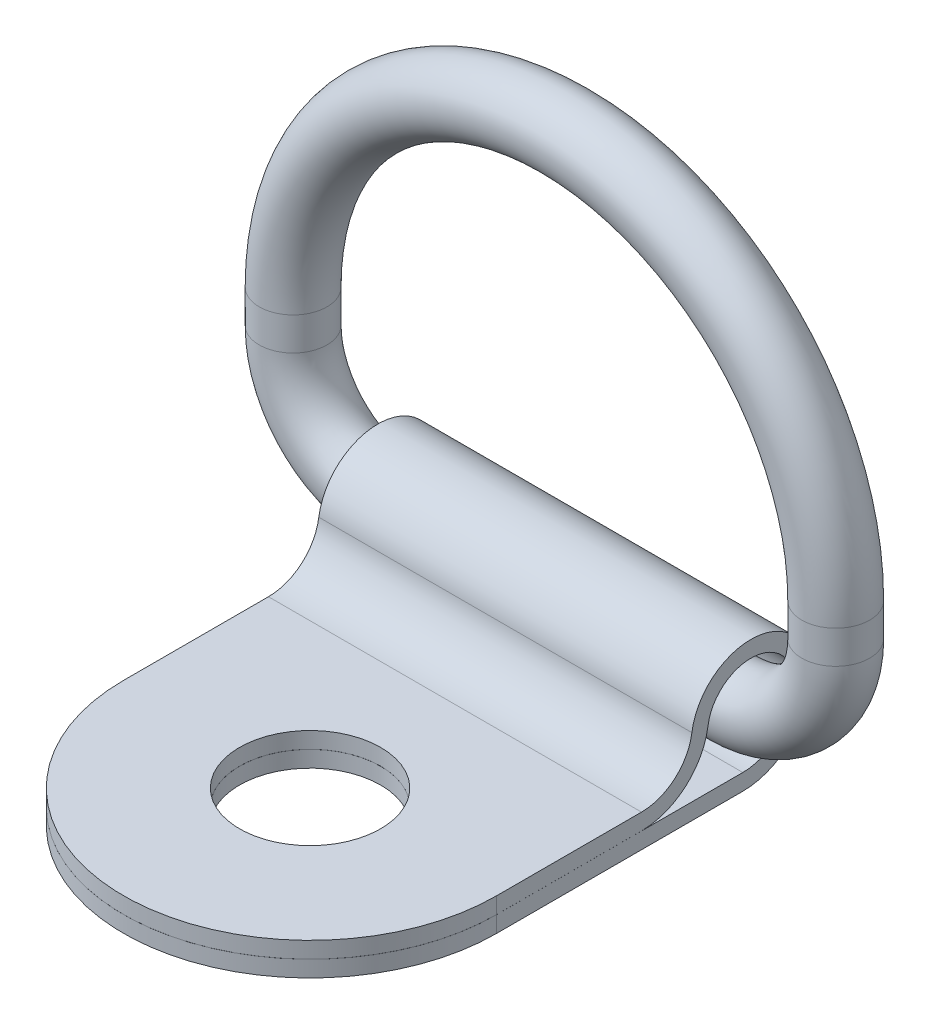
ISO-10303-21;
HEADER;
FILE_DESCRIPTION(('STEP AP214'),'2;1');
FILE_NAME('part.step','',(''),(''),'','','');
FILE_SCHEMA(('AUTOMOTIVE_DESIGN { 1 0 10303 214 1 1 1 1 }'));
ENDSEC;
DATA;
#1=APPLICATION_CONTEXT('core data for automotive mechanical design processes');
#2=APPLICATION_PROTOCOL_DEFINITION('international standard','automotive_design',2000,#1);
#3=PRODUCT_CONTEXT('',#1,'mechanical');
#4=PRODUCT('Part','Part','',(#3));
#5=PRODUCT_RELATED_PRODUCT_CATEGORY('part','',(#4));
#6=PRODUCT_DEFINITION_FORMATION('','',#4);
#7=PRODUCT_DEFINITION_CONTEXT('part definition',#1,'design');
#8=PRODUCT_DEFINITION('design','',#6,#7);
#9=PRODUCT_DEFINITION_SHAPE('','',#8);
#10=(LENGTH_UNIT() NAMED_UNIT(*) SI_UNIT(.MILLI.,.METRE.));
#11=(NAMED_UNIT(*) PLANE_ANGLE_UNIT() SI_UNIT($,.RADIAN.));
#12=(NAMED_UNIT(*) SI_UNIT($,.STERADIAN.) SOLID_ANGLE_UNIT());
#13=UNCERTAINTY_MEASURE_WITH_UNIT(LENGTH_MEASURE(1.E-05),#10,'distance_accuracy_value','');
#14=(GEOMETRIC_REPRESENTATION_CONTEXT(3) GLOBAL_UNCERTAINTY_ASSIGNED_CONTEXT((#13)) GLOBAL_UNIT_ASSIGNED_CONTEXT((#10,
#11,#12)) REPRESENTATION_CONTEXT('',''));
#15=CARTESIAN_POINT('',(0.,0.,0.));
#16=DIRECTION('',(0.,0.,1.));
#17=DIRECTION('',(1.,0.,0.));
#18=AXIS2_PLACEMENT_3D('',#15,#16,#17);
#19=CARTESIAN_POINT('',(8.73125,0.,0.381));
#20=DIRECTION('',(-1.,0.,0.));
#21=DIRECTION('',(0.,0.,1.));
#22=AXIS2_PLACEMENT_3D('',#19,#20,#21);
#23=CYLINDRICAL_SURFACE('',#22,3.175);
#24=DIRECTION('',(-1.,0.,0.));
#25=VECTOR('',#24,1.);
#26=CARTESIAN_POINT('',(8.73125,-1.24434078933385,-2.54));
#27=LINE('',#26,#25);
#28=CARTESIAN_POINT('',(8.73125,-1.24434078933385,-2.54));
#29=VERTEX_POINT('',#28);
#30=CARTESIAN_POINT('',(-8.73125,-1.24434078933385,-2.54));
#31=VERTEX_POINT('',#30);
#32=EDGE_CURVE('E61',#29,#31,#27,.T.);
#33=ORIENTED_EDGE('',*,*,#32,.F.);
#34=CARTESIAN_POINT('',(8.73125,0.,0.381));
#35=DIRECTION('',(1.,0.,0.));
#36=DIRECTION('',(0.,0.,-1.));
#37=AXIS2_PLACEMENT_3D('',#34,#35,#36);
#38=CIRCLE('',#37,3.175);
#39=CARTESIAN_POINT('',(8.73125,-3.175,0.381));
#40=VERTEX_POINT('',#39);
#41=EDGE_CURVE('E235',#40,#29,#38,.T.);
#42=ORIENTED_EDGE('',*,*,#41,.F.);
#43=DIRECTION('',(-1.,0.,0.));
#44=VECTOR('',#43,1.);
#45=CARTESIAN_POINT('',(8.73125,-3.175,0.381));
#46=LINE('',#45,#44);
#47=CARTESIAN_POINT('',(-8.73125,-3.175,0.381));
#48=VERTEX_POINT('',#47);
#49=EDGE_CURVE('E198',#40,#48,#46,.T.);
#50=ORIENTED_EDGE('',*,*,#49,.T.);
#51=CARTESIAN_POINT('',(-8.73125,0.,0.381));
#52=DIRECTION('',(1.,0.,0.));
#53=DIRECTION('',(0.,0.,-1.));
#54=AXIS2_PLACEMENT_3D('',#51,#52,#53);
#55=CIRCLE('',#54,3.175);
#56=EDGE_CURVE('E158',#48,#31,#55,.T.);
#57=ORIENTED_EDGE('',*,*,#56,.T.);
#58=EDGE_LOOP('',(#33,#42,#50,#57));
#59=FACE_BOUND('',#58,.T.);
#60=ADVANCED_FACE('F47',(#59),#23,.T.);
#61=CARTESIAN_POINT('',(8.73125,0.,0.));
#62=DIRECTION('',(-1.,0.,0.));
#63=DIRECTION('',(0.,0.,1.));
#64=AXIS2_PLACEMENT_3D('',#61,#62,#63);
#65=CYLINDRICAL_SURFACE('',#64,2.794);
#66=DIRECTION('',(-1.,0.,0.));
#67=VECTOR('',#66,1.);
#68=CARTESIAN_POINT('',(8.73125,1.16397422651878,-2.54));
#69=LINE('',#68,#67);
#70=CARTESIAN_POINT('',(-8.73125,1.16397422651878,-2.54));
#71=VERTEX_POINT('',#70);
#72=CARTESIAN_POINT('',(8.73125,1.16397422651878,-2.54));
#73=VERTEX_POINT('',#72);
#74=EDGE_CURVE('E140',#71,#73,#69,.F.);
#75=ORIENTED_EDGE('',*,*,#74,.F.);
#76=CARTESIAN_POINT('',(-8.73125,0.,0.));
#77=DIRECTION('',(1.,0.,0.));
#78=DIRECTION('',(0.,0.,1.));
#79=AXIS2_PLACEMENT_3D('',#76,#77,#78);
#80=CIRCLE('',#79,2.794);
#81=CARTESIAN_POINT('',(-8.73125,0.395616687116565,2.76584949642509));
#82=VERTEX_POINT('',#81);
#83=EDGE_CURVE('E150',#71,#82,#80,.T.);
#84=ORIENTED_EDGE('',*,*,#83,.T.);
#85=DIRECTION('',(-1.,0.,0.));
#86=VECTOR('',#85,1.);
#87=CARTESIAN_POINT('',(8.73125,0.395616687116565,2.76584949642509));
#88=LINE('',#87,#86);
#89=CARTESIAN_POINT('',(8.73125,0.395616687116565,2.76584949642509));
#90=VERTEX_POINT('',#89);
#91=EDGE_CURVE('E196',#90,#82,#88,.T.);
#92=ORIENTED_EDGE('',*,*,#91,.F.);
#93=CARTESIAN_POINT('',(8.73125,0.,0.));
#94=DIRECTION('',(1.,0.,0.));
#95=DIRECTION('',(0.,0.,1.));
#96=AXIS2_PLACEMENT_3D('',#93,#94,#95);
#97=CIRCLE('',#96,2.794);
#98=EDGE_CURVE('E152',#73,#90,#97,.T.);
#99=ORIENTED_EDGE('',*,*,#98,.F.);
#100=EDGE_LOOP('',(#75,#84,#92,#99));
#101=FACE_BOUND('',#100,.T.);
#102=ADVANCED_FACE('F148',(#101),#65,.T.);
#103=CARTESIAN_POINT('',(8.73125,0.,0.381));
#104=DIRECTION('',(1.,0.,0.));
#105=DIRECTION('',(0.,0.,-1.));
#106=AXIS2_PLACEMENT_3D('',#103,#104,#105);
#107=PLANE('',#106);
#108=ORIENTED_EDGE('',*,*,#41,.T.);
#109=DIRECTION('',(0.,1.,0.));
#110=VECTOR('',#109,1.);
#111=CARTESIAN_POINT('',(8.73125,0.,-2.54));
#112=LINE('',#111,#110);
#113=EDGE_CURVE('E212',#29,#73,#112,.T.);
#114=ORIENTED_EDGE('',*,*,#113,.T.);
#115=ORIENTED_EDGE('',*,*,#98,.T.);
#116=CARTESIAN_POINT('',(8.73125,0.73279,5.1231075899692));
#117=DIRECTION('',(-1.,0.,0.));
#118=DIRECTION('',(0.,0.,1.));
#119=AXIS2_PLACEMENT_3D('',#116,#117,#118);
#120=CIRCLE('',#119,2.38125);
#121=CARTESIAN_POINT('',(8.73125,-1.64846,5.1231075899692));
#122=VERTEX_POINT('',#121);
#123=EDGE_CURVE('E239',#90,#122,#120,.T.);
#124=ORIENTED_EDGE('',*,*,#123,.T.);
#125=DIRECTION('',(0.,0.,1.));
#126=VECTOR('',#125,1.);
#127=CARTESIAN_POINT('',(8.73125,-1.64846,20.6375));
#128=LINE('',#127,#126);
#129=CARTESIAN_POINT('',(8.73125,-1.64846,11.90625));
#130=VERTEX_POINT('',#129);
#131=EDGE_CURVE('E241',#122,#130,#128,.T.);
#132=ORIENTED_EDGE('',*,*,#131,.T.);
#133=DIRECTION('',(0.,-1.,0.));
#134=VECTOR('',#133,1.);
#135=CARTESIAN_POINT('',(8.73125,20.6375,11.90625));
#136=LINE('',#135,#134);
#137=CARTESIAN_POINT('',(8.73125,-2.41046,11.90625));
#138=VERTEX_POINT('',#137);
#139=EDGE_CURVE('E226',#130,#138,#136,.T.);
#140=ORIENTED_EDGE('',*,*,#139,.T.);
#141=DIRECTION('',(0.,0.,-1.));
#142=VECTOR('',#141,1.);
#143=CARTESIAN_POINT('',(8.73125,-2.41046,20.6375));
#144=LINE('',#143,#142);
#145=CARTESIAN_POINT('',(8.73125,-2.41046,5.1231075899692));
#146=VERTEX_POINT('',#145);
#147=EDGE_CURVE('E244',#138,#146,#144,.T.);
#148=ORIENTED_EDGE('',*,*,#147,.T.);
#149=CARTESIAN_POINT('',(8.73125,0.73279,5.1231075899692));
#150=DIRECTION('',(1.,0.,0.));
#151=DIRECTION('',(0.,0.,-1.));
#152=AXIS2_PLACEMENT_3D('',#149,#150,#151);
#153=CIRCLE('',#152,3.14325);
#154=CARTESIAN_POINT('',(8.73125,0.287721226993863,2.01152690649097));
#155=VERTEX_POINT('',#154);
#156=EDGE_CURVE('E246',#146,#155,#153,.T.);
#157=ORIENTED_EDGE('',*,*,#156,.T.);
#158=CARTESIAN_POINT('',(8.73125,0.,0.));
#159=DIRECTION('',(-1.,0.,0.));
#160=DIRECTION('',(0.,0.,1.));
#161=AXIS2_PLACEMENT_3D('',#158,#159,#160);
#162=CIRCLE('',#161,2.032);
#163=CARTESIAN_POINT('',(8.73125,0.,-2.032));
#164=VERTEX_POINT('',#163);
#165=EDGE_CURVE('E248',#155,#164,#162,.T.);
#166=ORIENTED_EDGE('',*,*,#165,.T.);
#167=CARTESIAN_POINT('',(8.73125,0.,0.381));
#168=DIRECTION('',(-1.,0.,0.));
#169=DIRECTION('',(0.,0.,-1.));
#170=AXIS2_PLACEMENT_3D('',#167,#168,#169);
#171=CIRCLE('',#170,2.413);
#172=CARTESIAN_POINT('',(8.73125,-2.413,0.381));
#173=VERTEX_POINT('',#172);
#174=EDGE_CURVE('E250',#164,#173,#171,.T.);
#175=ORIENTED_EDGE('',*,*,#174,.T.);
#176=DIRECTION('',(0.,0.,1.));
#177=VECTOR('',#176,1.);
#178=CARTESIAN_POINT('',(8.73125,-2.413,20.6375));
#179=LINE('',#178,#177);
#180=CARTESIAN_POINT('',(8.73125,-2.413,11.90625));
#181=VERTEX_POINT('',#180);
#182=EDGE_CURVE('E184',#173,#181,#179,.T.);
#183=ORIENTED_EDGE('',*,*,#182,.T.);
#184=CARTESIAN_POINT('',(8.73125,-3.175,11.90625));
#185=VERTEX_POINT('',#184);
#186=EDGE_CURVE('E223',#181,#185,#136,.T.);
#187=ORIENTED_EDGE('',*,*,#186,.T.);
#188=DIRECTION('',(0.,0.,-1.));
#189=VECTOR('',#188,1.);
#190=CARTESIAN_POINT('',(8.73125,-3.175,20.6375));
#191=LINE('',#190,#189);
#192=EDGE_CURVE('E179',#185,#40,#191,.T.);
#193=ORIENTED_EDGE('',*,*,#192,.T.);
#194=EDGE_LOOP('',(#108,#114,#115,#124,#132,#140,#148,#157,#166,#175,#183,#187,#193));
#195=FACE_BOUND('',#194,.T.);
#196=ADVANCED_FACE('F262',(#195),#107,.T.);
#197=CARTESIAN_POINT('',(-8.73125,0.,0.381));
#198=DIRECTION('',(1.,0.,0.));
#199=DIRECTION('',(0.,0.,-1.));
#200=AXIS2_PLACEMENT_3D('',#197,#198,#199);
#201=PLANE('',#200);
#202=DIRECTION('',(0.,1.,0.));
#203=VECTOR('',#202,1.);
#204=CARTESIAN_POINT('',(-8.73125,0.,-2.54));
#205=LINE('',#204,#203);
#206=EDGE_CURVE('E12',#31,#71,#205,.T.);
#207=ORIENTED_EDGE('',*,*,#206,.F.);
#208=ORIENTED_EDGE('',*,*,#56,.F.);
#209=DIRECTION('',(0.,0.,-1.));
#210=VECTOR('',#209,1.);
#211=CARTESIAN_POINT('',(-8.73125,-3.175,20.6375));
#212=LINE('',#211,#210);
#213=CARTESIAN_POINT('',(-8.73125,-3.175,11.90625));
#214=VERTEX_POINT('',#213);
#215=EDGE_CURVE('E162',#214,#48,#212,.T.);
#216=ORIENTED_EDGE('',*,*,#215,.F.);
#217=DIRECTION('',(0.,-1.,0.));
#218=VECTOR('',#217,1.);
#219=CARTESIAN_POINT('',(-8.73125,20.6375,11.90625));
#220=LINE('',#219,#218);
#221=CARTESIAN_POINT('',(-8.73125,-2.413,11.90625));
#222=VERTEX_POINT('',#221);
#223=EDGE_CURVE('E55',#214,#222,#220,.F.);
#224=ORIENTED_EDGE('',*,*,#223,.T.);
#225=DIRECTION('',(0.,0.,1.));
#226=VECTOR('',#225,1.);
#227=CARTESIAN_POINT('',(-8.73125,-2.413,20.6375));
#228=LINE('',#227,#226);
#229=CARTESIAN_POINT('',(-8.73125,-2.413,0.381));
#230=VERTEX_POINT('',#229);
#231=EDGE_CURVE('E176',#230,#222,#228,.T.);
#232=ORIENTED_EDGE('',*,*,#231,.F.);
#233=CARTESIAN_POINT('',(-8.73125,0.,0.381));
#234=DIRECTION('',(-1.,0.,0.));
#235=DIRECTION('',(0.,0.,-1.));
#236=AXIS2_PLACEMENT_3D('',#233,#234,#235);
#237=CIRCLE('',#236,2.413);
#238=CARTESIAN_POINT('',(-8.73125,0.,-2.032));
#239=VERTEX_POINT('',#238);
#240=EDGE_CURVE('E174',#239,#230,#237,.T.);
#241=ORIENTED_EDGE('',*,*,#240,.F.);
#242=CARTESIAN_POINT('',(-8.73125,0.,0.));
#243=DIRECTION('',(-1.,0.,0.));
#244=DIRECTION('',(0.,0.,1.));
#245=AXIS2_PLACEMENT_3D('',#242,#243,#244);
#246=CIRCLE('',#245,2.032);
#247=CARTESIAN_POINT('',(-8.73125,0.287721226993863,2.01152690649097));
#248=VERTEX_POINT('',#247);
#249=EDGE_CURVE('E172',#248,#239,#246,.T.);
#250=ORIENTED_EDGE('',*,*,#249,.F.);
#251=CARTESIAN_POINT('',(-8.73125,0.73279,5.1231075899692));
#252=DIRECTION('',(1.,0.,0.));
#253=DIRECTION('',(0.,0.,-1.));
#254=AXIS2_PLACEMENT_3D('',#251,#252,#253);
#255=CIRCLE('',#254,3.14325);
#256=CARTESIAN_POINT('',(-8.73125,-2.41046,5.1231075899692));
#257=VERTEX_POINT('',#256);
#258=EDGE_CURVE('E170',#257,#248,#255,.T.);
#259=ORIENTED_EDGE('',*,*,#258,.F.);
#260=DIRECTION('',(0.,0.,-1.));
#261=VECTOR('',#260,1.);
#262=CARTESIAN_POINT('',(-8.73125,-2.41046,20.6375));
#263=LINE('',#262,#261);
#264=CARTESIAN_POINT('',(-8.73125,-2.41046,11.90625));
#265=VERTEX_POINT('',#264);
#266=EDGE_CURVE('E168',#265,#257,#263,.T.);
#267=ORIENTED_EDGE('',*,*,#266,.F.);
#268=CARTESIAN_POINT('',(-8.73125,-1.64846,11.90625));
#269=VERTEX_POINT('',#268);
#270=EDGE_CURVE('E201',#265,#269,#220,.F.);
#271=ORIENTED_EDGE('',*,*,#270,.T.);
#272=DIRECTION('',(0.,0.,1.));
#273=VECTOR('',#272,1.);
#274=CARTESIAN_POINT('',(-8.73125,-1.64846,20.6375));
#275=LINE('',#274,#273);
#276=CARTESIAN_POINT('',(-8.73125,-1.64846,5.1231075899692));
#277=VERTEX_POINT('',#276);
#278=EDGE_CURVE('E160',#277,#269,#275,.T.);
#279=ORIENTED_EDGE('',*,*,#278,.F.);
#280=CARTESIAN_POINT('',(-8.73125,0.73279,5.1231075899692));
#281=DIRECTION('',(-1.,0.,0.));
#282=DIRECTION('',(0.,0.,1.));
#283=AXIS2_PLACEMENT_3D('',#280,#281,#282);
#284=CIRCLE('',#283,2.38125);
#285=EDGE_CURVE('E157',#82,#277,#284,.T.);
#286=ORIENTED_EDGE('',*,*,#285,.F.);
#287=ORIENTED_EDGE('',*,*,#83,.F.);
#288=EDGE_LOOP('',(#207,#208,#216,#224,#232,#241,#250,#259,#267,#271,#279,#286,#287));
#289=FACE_BOUND('',#288,.T.);
#290=ADVANCED_FACE('F155',(#289),#201,.F.);
#291=CARTESIAN_POINT('',(8.73125,-3.175,20.6375));
#292=DIRECTION('',(0.,1.,0.));
#293=DIRECTION('',(0.,0.,1.));
#294=AXIS2_PLACEMENT_3D('',#291,#292,#293);
#295=PLANE('',#294);
#296=CARTESIAN_POINT('',(0.,-3.175,11.90625));
#297=DIRECTION('',(0.,-1.,0.));
#298=DIRECTION('',(0.,0.,-1.));
#299=AXIS2_PLACEMENT_3D('',#296,#297,#298);
#300=CIRCLE('',#299,3.302);
#301=CARTESIAN_POINT('',(0.,-3.175,8.60425));
#302=VERTEX_POINT('',#301);
#303=EDGE_CURVE('E205',#302,#302,#300,.T.);
#304=ORIENTED_EDGE('',*,*,#303,.F.);
#305=EDGE_LOOP('',(#304));
#306=FACE_BOUND('',#305,.T.);
#307=CARTESIAN_POINT('',(0.,-3.175,11.90625));
#308=DIRECTION('',(0.,1.,0.));
#309=DIRECTION('',(0.,0.,-1.));
#310=AXIS2_PLACEMENT_3D('',#307,#308,#309);
#311=CIRCLE('',#310,8.73125);
#312=EDGE_CURVE('E221',#214,#185,#311,.T.);
#313=ORIENTED_EDGE('',*,*,#312,.F.);
#314=ORIENTED_EDGE('',*,*,#215,.T.);
#315=ORIENTED_EDGE('',*,*,#49,.F.);
#316=ORIENTED_EDGE('',*,*,#192,.F.);
#317=EDGE_LOOP('',(#313,#314,#315,#316));
#318=FACE_BOUND('',#317,.T.);
#319=ADVANCED_FACE('F49',(#306,#318),#295,.F.);
#320=CARTESIAN_POINT('',(8.73125,0.73279,5.1231075899692));
#321=DIRECTION('',(-1.,0.,0.));
#322=DIRECTION('',(0.,0.,1.));
#323=AXIS2_PLACEMENT_3D('',#320,#321,#322);
#324=CYLINDRICAL_SURFACE('',#323,2.38125);
#325=ORIENTED_EDGE('',*,*,#285,.T.);
#326=DIRECTION('',(-1.,0.,0.));
#327=VECTOR('',#326,1.);
#328=CARTESIAN_POINT('',(8.73125,-1.64846,5.1231075899692));
#329=LINE('',#328,#327);
#330=EDGE_CURVE('E193',#122,#277,#329,.T.);
#331=ORIENTED_EDGE('',*,*,#330,.F.);
#332=ORIENTED_EDGE('',*,*,#123,.F.);
#333=ORIENTED_EDGE('',*,*,#91,.T.);
#334=EDGE_LOOP('',(#325,#331,#332,#333));
#335=FACE_BOUND('',#334,.T.);
#336=ADVANCED_FACE('F297',(#335),#324,.F.);
#337=CARTESIAN_POINT('',(8.73125,-1.64846,20.6375));
#338=DIRECTION('',(0.,-1.,0.));
#339=DIRECTION('',(0.,0.,-1.));
#340=AXIS2_PLACEMENT_3D('',#337,#338,#339);
#341=PLANE('',#340);
#342=CARTESIAN_POINT('',(0.,-1.64846,11.90625));
#343=DIRECTION('',(0.,-1.,0.));
#344=DIRECTION('',(0.,0.,-1.));
#345=AXIS2_PLACEMENT_3D('',#342,#343,#344);
#346=CIRCLE('',#345,3.302);
#347=CARTESIAN_POINT('',(0.,-1.64846,8.60425));
#348=VERTEX_POINT('',#347);
#349=EDGE_CURVE('E209',#348,#348,#346,.T.);
#350=ORIENTED_EDGE('',*,*,#349,.T.);
#351=EDGE_LOOP('',(#350));
#352=FACE_BOUND('',#351,.T.);
#353=ORIENTED_EDGE('',*,*,#278,.T.);
#354=CARTESIAN_POINT('',(0.,-1.64846,11.90625));
#355=DIRECTION('',(0.,-1.,0.));
#356=DIRECTION('',(0.,0.,-1.));
#357=AXIS2_PLACEMENT_3D('',#354,#355,#356);
#358=CIRCLE('',#357,8.73125);
#359=EDGE_CURVE('E69',#269,#130,#358,.F.);
#360=ORIENTED_EDGE('',*,*,#359,.T.);
#361=ORIENTED_EDGE('',*,*,#131,.F.);
#362=ORIENTED_EDGE('',*,*,#330,.T.);
#363=EDGE_LOOP('',(#353,#360,#361,#362));
#364=FACE_BOUND('',#363,.T.);
#365=ADVANCED_FACE('F295',(#352,#364),#341,.F.);
#366=CARTESIAN_POINT('',(8.73125,-2.41046,20.6375));
#367=DIRECTION('',(0.,1.,0.));
#368=DIRECTION('',(0.,0.,1.));
#369=AXIS2_PLACEMENT_3D('',#366,#367,#368);
#370=PLANE('',#369);
#371=CARTESIAN_POINT('',(0.,-2.41046,11.90625));
#372=DIRECTION('',(0.,1.,0.));
#373=DIRECTION('',(0.,0.,1.));
#374=AXIS2_PLACEMENT_3D('',#371,#372,#373);
#375=CIRCLE('',#374,3.302);
#376=CARTESIAN_POINT('',(0.,-2.41046,15.20825));
#377=VERTEX_POINT('',#376);
#378=EDGE_CURVE('E204',#377,#377,#375,.T.);
#379=ORIENTED_EDGE('',*,*,#378,.T.);
#380=EDGE_LOOP('',(#379));
#381=FACE_BOUND('',#380,.T.);
#382=ORIENTED_EDGE('',*,*,#147,.F.);
#383=CARTESIAN_POINT('',(0.,-2.41046,11.90625));
#384=DIRECTION('',(0.,1.,0.));
#385=DIRECTION('',(0.,0.,1.));
#386=AXIS2_PLACEMENT_3D('',#383,#384,#385);
#387=CIRCLE('',#386,8.73125);
#388=EDGE_CURVE('E230',#138,#265,#387,.F.);
#389=ORIENTED_EDGE('',*,*,#388,.T.);
#390=ORIENTED_EDGE('',*,*,#266,.T.);
#391=DIRECTION('',(-1.,0.,0.));
#392=VECTOR('',#391,1.);
#393=CARTESIAN_POINT('',(8.73125,-2.41046,5.1231075899692));
#394=LINE('',#393,#392);
#395=EDGE_CURVE('E190',#146,#257,#394,.T.);
#396=ORIENTED_EDGE('',*,*,#395,.F.);
#397=EDGE_LOOP('',(#382,#389,#390,#396));
#398=FACE_BOUND('',#397,.T.);
#399=ADVANCED_FACE('F288',(#381,#398),#370,.F.);
#400=CARTESIAN_POINT('',(8.73125,0.73279,5.1231075899692));
#401=DIRECTION('',(-1.,0.,0.));
#402=DIRECTION('',(0.,0.,1.));
#403=AXIS2_PLACEMENT_3D('',#400,#401,#402);
#404=CYLINDRICAL_SURFACE('',#403,3.14325);
#405=ORIENTED_EDGE('',*,*,#258,.T.);
#406=DIRECTION('',(-1.,0.,0.));
#407=VECTOR('',#406,1.);
#408=CARTESIAN_POINT('',(8.73125,0.287721226993863,2.01152690649097));
#409=LINE('',#408,#407);
#410=EDGE_CURVE('E187',#155,#248,#409,.T.);
#411=ORIENTED_EDGE('',*,*,#410,.F.);
#412=ORIENTED_EDGE('',*,*,#156,.F.);
#413=ORIENTED_EDGE('',*,*,#395,.T.);
#414=EDGE_LOOP('',(#405,#411,#412,#413));
#415=FACE_BOUND('',#414,.T.);
#416=ADVANCED_FACE('F283',(#415),#404,.T.);
#417=CARTESIAN_POINT('',(8.73125,0.,0.));
#418=DIRECTION('',(-1.,0.,0.));
#419=DIRECTION('',(0.,0.,1.));
#420=AXIS2_PLACEMENT_3D('',#417,#418,#419);
#421=CYLINDRICAL_SURFACE('',#420,2.032);
#422=ORIENTED_EDGE('',*,*,#249,.T.);
#423=DIRECTION('',(-1.,0.,0.));
#424=VECTOR('',#423,1.);
#425=CARTESIAN_POINT('',(8.73125,0.,-2.032));
#426=LINE('',#425,#424);
#427=EDGE_CURVE('E183',#164,#239,#426,.T.);
#428=ORIENTED_EDGE('',*,*,#427,.F.);
#429=ORIENTED_EDGE('',*,*,#165,.F.);
#430=ORIENTED_EDGE('',*,*,#410,.T.);
#431=EDGE_LOOP('',(#422,#428,#429,#430));
#432=FACE_BOUND('',#431,.T.);
#433=ADVANCED_FACE('F279',(#432),#421,.F.);
#434=CARTESIAN_POINT('',(8.73125,0.,0.381));
#435=DIRECTION('',(-1.,0.,0.));
#436=DIRECTION('',(0.,0.,1.));
#437=AXIS2_PLACEMENT_3D('',#434,#435,#436);
#438=CYLINDRICAL_SURFACE('',#437,2.413);
#439=ORIENTED_EDGE('',*,*,#240,.T.);
#440=DIRECTION('',(-1.,0.,0.));
#441=VECTOR('',#440,1.);
#442=CARTESIAN_POINT('',(8.73125,-2.413,0.381));
#443=LINE('',#442,#441);
#444=EDGE_CURVE('E180',#173,#230,#443,.T.);
#445=ORIENTED_EDGE('',*,*,#444,.F.);
#446=ORIENTED_EDGE('',*,*,#174,.F.);
#447=ORIENTED_EDGE('',*,*,#427,.T.);
#448=EDGE_LOOP('',(#439,#445,#446,#447));
#449=FACE_BOUND('',#448,.T.);
#450=ADVANCED_FACE('F274',(#449),#438,.F.);
#451=CARTESIAN_POINT('',(8.73125,-2.413,20.6375));
#452=DIRECTION('',(0.,-1.,0.));
#453=DIRECTION('',(0.,0.,-1.));
#454=AXIS2_PLACEMENT_3D('',#451,#452,#453);
#455=PLANE('',#454);
#456=CARTESIAN_POINT('',(0.,-2.413,11.90625));
#457=DIRECTION('',(0.,-1.,0.));
#458=DIRECTION('',(0.,0.,-1.));
#459=AXIS2_PLACEMENT_3D('',#456,#457,#458);
#460=CIRCLE('',#459,3.302);
#461=CARTESIAN_POINT('',(0.,-2.413,8.60425));
#462=VERTEX_POINT('',#461);
#463=EDGE_CURVE('E202',#462,#462,#460,.T.);
#464=ORIENTED_EDGE('',*,*,#463,.T.);
#465=EDGE_LOOP('',(#464));
#466=FACE_BOUND('',#465,.T.);
#467=ORIENTED_EDGE('',*,*,#231,.T.);
#468=CARTESIAN_POINT('',(0.,-2.413,11.90625));
#469=DIRECTION('',(0.,-1.,0.));
#470=DIRECTION('',(0.,0.,-1.));
#471=AXIS2_PLACEMENT_3D('',#468,#469,#470);
#472=CIRCLE('',#471,8.73125);
#473=EDGE_CURVE('E227',#222,#181,#472,.F.);
#474=ORIENTED_EDGE('',*,*,#473,.T.);
#475=ORIENTED_EDGE('',*,*,#182,.F.);
#476=ORIENTED_EDGE('',*,*,#444,.T.);
#477=EDGE_LOOP('',(#467,#474,#475,#476));
#478=FACE_BOUND('',#477,.T.);
#479=ADVANCED_FACE('F267',(#466,#478),#455,.F.);
#480=CARTESIAN_POINT('',(0.,20.6375,11.90625));
#481=DIRECTION('',(0.,-1.,0.));
#482=DIRECTION('',(0.,0.,-1.));
#483=AXIS2_PLACEMENT_3D('',#480,#481,#482);
#484=CYLINDRICAL_SURFACE('',#483,8.73125);
#485=ORIENTED_EDGE('',*,*,#270,.F.);
#486=ORIENTED_EDGE('',*,*,#388,.F.);
#487=ORIENTED_EDGE('',*,*,#139,.F.);
#488=ORIENTED_EDGE('',*,*,#359,.F.);
#489=EDGE_LOOP('',(#485,#486,#487,#488));
#490=FACE_BOUND('',#489,.T.);
#491=ADVANCED_FACE('F290',(#490),#484,.T.);
#492=ORIENTED_EDGE('',*,*,#312,.T.);
#493=ORIENTED_EDGE('',*,*,#186,.F.);
#494=ORIENTED_EDGE('',*,*,#473,.F.);
#495=ORIENTED_EDGE('',*,*,#223,.F.);
#496=EDGE_LOOP('',(#492,#493,#494,#495));
#497=FACE_BOUND('',#496,.T.);
#498=ADVANCED_FACE('F265',(#497),#484,.T.);
#499=CARTESIAN_POINT('',(0.,20.6375,11.90625));
#500=DIRECTION('',(0.,-1.,0.));
#501=DIRECTION('',(0.,0.,-1.));
#502=AXIS2_PLACEMENT_3D('',#499,#500,#501);
#503=CYLINDRICAL_SURFACE('',#502,3.302);
#504=ORIENTED_EDGE('',*,*,#303,.T.);
#505=EDGE_LOOP('',(#504));
#506=FACE_BOUND('',#505,.T.);
#507=ORIENTED_EDGE('',*,*,#463,.F.);
#508=EDGE_LOOP('',(#507));
#509=FACE_BOUND('',#508,.T.);
#510=ADVANCED_FACE('F341',(#506,#509),#503,.F.);
#511=ORIENTED_EDGE('',*,*,#378,.F.);
#512=EDGE_LOOP('',(#511));
#513=FACE_BOUND('',#512,.T.);
#514=ORIENTED_EDGE('',*,*,#349,.F.);
#515=EDGE_LOOP('',(#514));
#516=FACE_BOUND('',#515,.T.);
#517=ADVANCED_FACE('F338',(#513,#516),#503,.F.);
#518=CARTESIAN_POINT('',(0.,0.,-2.54));
#519=DIRECTION('',(0.,0.,-1.));
#520=DIRECTION('',(-1.,0.,0.));
#521=AXIS2_PLACEMENT_3D('',#518,#519,#520);
#522=PLANE('',#521);
#523=ORIENTED_EDGE('',*,*,#32,.T.);
#524=ORIENTED_EDGE('',*,*,#206,.T.);
#525=ORIENTED_EDGE('',*,*,#74,.T.);
#526=ORIENTED_EDGE('',*,*,#113,.F.);
#527=EDGE_LOOP('',(#523,#524,#525,#526));
#528=FACE_BOUND('',#527,.T.);
#529=ADVANCED_FACE('F139',(#528),#522,.T.);
#530=CLOSED_SHELL('',(#60,#102,#196,#290,#319,#336,#365,#399,#416,#433,#450,#479,#491,#498,#510,
#517,#529));
#531=MANIFOLD_SOLID_BREP('B2',#530);
#532=CARTESIAN_POINT('',(7.89409875810043,4.80590124189957,0.));
#533=DIRECTION('',(0.,0.,-1.));
#534=DIRECTION('',(-1.,0.,0.));
#535=AXIS2_PLACEMENT_3D('',#532,#533,#534);
#536=TOROIDAL_SURFACE('',#535,4.80590124189957,1.5875);
#537=CARTESIAN_POINT('',(12.7,4.80590124189957,0.));
#538=DIRECTION('',(0.,1.,0.));
#539=DIRECTION('',(0.,0.,-1.));
#540=AXIS2_PLACEMENT_3D('',#537,#538,#539);
#541=CIRCLE('',#540,1.5875);
#542=CARTESIAN_POINT('',(14.2875,4.80590124189958,0.));
#543=VERTEX_POINT('',#542);
#544=EDGE_CURVE('E450',#543,#543,#541,.T.);
#545=CARTESIAN_POINT('',(7.89409875810044,0.,0.));
#546=DIRECTION('',(1.,0.,0.));
#547=DIRECTION('',(0.,0.,-1.));
#548=AXIS2_PLACEMENT_3D('',#545,#546,#547);
#549=CIRCLE('',#548,1.5875);
#550=CARTESIAN_POINT('',(7.89409875810044,-1.5875,0.));
#551=VERTEX_POINT('',#550);
#552=EDGE_CURVE('E46',#551,#551,#549,.T.);
#553=CARTESIAN_POINT('',(7.89409875810043,4.80590124189957,0.));
#554=DIRECTION('',(0.,0.,-1.));
#555=DIRECTION('',(-1.,0.,0.));
#556=AXIS2_PLACEMENT_3D('',#553,#554,#555);
#557=CIRCLE('',#556,6.39340124189957);
#558=EDGE_CURVE('',#543,#551,#557,.T.);
#559=ORIENTED_EDGE('',*,*,#544,.F.);
#560=ORIENTED_EDGE('',*,*,#552,.T.);
#561=ORIENTED_EDGE('',*,*,#558,.T.);
#562=ORIENTED_EDGE('',*,*,#558,.F.);
#563=EDGE_LOOP('',(#559,#561,#560,#562));
#564=FACE_BOUND('',#563,.T.);
#565=ADVANCED_FACE('F443',(#564),#536,.T.);
#566=CARTESIAN_POINT('',(12.7,6.35,0.));
#567=DIRECTION('',(0.,-1.,0.));
#568=DIRECTION('',(1.,0.,0.));
#569=AXIS2_PLACEMENT_3D('',#566,#567,#568);
#570=CYLINDRICAL_SURFACE('',#569,1.5875);
#571=CARTESIAN_POINT('',(12.7,6.35,0.));
#572=DIRECTION('',(0.,1.,0.));
#573=DIRECTION('',(0.,0.,-1.));
#574=AXIS2_PLACEMENT_3D('',#571,#572,#573);
#575=CIRCLE('',#574,1.5875);
#576=CARTESIAN_POINT('',(14.2875,6.35,0.));
#577=VERTEX_POINT('',#576);
#578=EDGE_CURVE('E455',#577,#577,#575,.T.);
#579=ORIENTED_EDGE('',*,*,#578,.F.);
#580=EDGE_LOOP('',(#579));
#581=FACE_BOUND('',#580,.T.);
#582=ORIENTED_EDGE('',*,*,#544,.T.);
#583=EDGE_LOOP('',(#582));
#584=FACE_BOUND('',#583,.T.);
#585=ADVANCED_FACE('F493',(#581,#584),#570,.T.);
#586=CARTESIAN_POINT('',(0.,6.35,0.));
#587=DIRECTION('',(0.,0.,-1.));
#588=DIRECTION('',(-1.,0.,0.));
#589=AXIS2_PLACEMENT_3D('',#586,#587,#588);
#590=TOROIDAL_SURFACE('',#589,12.7,1.5875);
#591=CARTESIAN_POINT('',(-12.7,6.34999999999999,0.));
#592=DIRECTION('',(0.,-1.,0.));
#593=DIRECTION('',(0.,0.,-1.));
#594=AXIS2_PLACEMENT_3D('',#591,#592,#593);
#595=CIRCLE('',#594,1.5875);
#596=CARTESIAN_POINT('',(-14.2875,6.34999999999999,0.));
#597=VERTEX_POINT('',#596);
#598=EDGE_CURVE('E460',#597,#597,#595,.T.);
#599=CARTESIAN_POINT('',(0.,6.35,0.));
#600=DIRECTION('',(0.,0.,-1.));
#601=DIRECTION('',(-1.,0.,0.));
#602=AXIS2_PLACEMENT_3D('',#599,#600,#601);
#603=CIRCLE('',#602,14.2875);
#604=EDGE_CURVE('',#597,#577,#603,.T.);
#605=ORIENTED_EDGE('',*,*,#598,.F.);
#606=ORIENTED_EDGE('',*,*,#578,.T.);
#607=ORIENTED_EDGE('',*,*,#604,.T.);
#608=ORIENTED_EDGE('',*,*,#604,.F.);
#609=EDGE_LOOP('',(#605,#607,#606,#608));
#610=FACE_BOUND('',#609,.T.);
#611=ADVANCED_FACE('F487',(#610),#590,.T.);
#612=CARTESIAN_POINT('',(-12.7,4.80590124189956,0.));
#613=DIRECTION('',(0.,1.,0.));
#614=DIRECTION('',(-1.,0.,0.));
#615=AXIS2_PLACEMENT_3D('',#612,#613,#614);
#616=CYLINDRICAL_SURFACE('',#615,1.5875);
#617=CARTESIAN_POINT('',(-12.7,4.80590124189956,0.));
#618=DIRECTION('',(0.,-1.,0.));
#619=DIRECTION('',(0.,0.,-1.));
#620=AXIS2_PLACEMENT_3D('',#617,#618,#619);
#621=CIRCLE('',#620,1.5875);
#622=CARTESIAN_POINT('',(-14.2875,4.80590124189956,0.));
#623=VERTEX_POINT('',#622);
#624=EDGE_CURVE('E466',#623,#623,#621,.T.);
#625=ORIENTED_EDGE('',*,*,#624,.F.);
#626=EDGE_LOOP('',(#625));
#627=FACE_BOUND('',#626,.T.);
#628=ORIENTED_EDGE('',*,*,#598,.T.);
#629=EDGE_LOOP('',(#628));
#630=FACE_BOUND('',#629,.T.);
#631=ADVANCED_FACE('F481',(#627,#630),#616,.T.);
#632=CARTESIAN_POINT('',(-7.89409875810043,4.80590124189957,0.));
#633=DIRECTION('',(0.,0.,-1.));
#634=DIRECTION('',(-1.,0.,0.));
#635=AXIS2_PLACEMENT_3D('',#632,#633,#634);
#636=TOROIDAL_SURFACE('',#635,4.80590124189957,1.5875);
#637=CARTESIAN_POINT('',(-7.89409875810043,0.,0.));
#638=DIRECTION('',(1.,0.,0.));
#639=DIRECTION('',(0.,0.,-1.));
#640=AXIS2_PLACEMENT_3D('',#637,#638,#639);
#641=CIRCLE('',#640,1.5875);
#642=CARTESIAN_POINT('',(-7.89409875810043,-1.5875,0.));
#643=VERTEX_POINT('',#642);
#644=EDGE_CURVE('E470',#643,#643,#641,.T.);
#645=CARTESIAN_POINT('',(-7.89409875810043,4.80590124189957,0.));
#646=DIRECTION('',(0.,0.,-1.));
#647=DIRECTION('',(-1.,0.,0.));
#648=AXIS2_PLACEMENT_3D('',#645,#646,#647);
#649=CIRCLE('',#648,6.39340124189957);
#650=EDGE_CURVE('',#643,#623,#649,.T.);
#651=ORIENTED_EDGE('',*,*,#644,.F.);
#652=ORIENTED_EDGE('',*,*,#624,.T.);
#653=ORIENTED_EDGE('',*,*,#650,.T.);
#654=ORIENTED_EDGE('',*,*,#650,.F.);
#655=EDGE_LOOP('',(#651,#653,#652,#654));
#656=FACE_BOUND('',#655,.T.);
#657=ADVANCED_FACE('F478',(#656),#636,.T.);
#658=CARTESIAN_POINT('',(-7.89409875810043,0.,0.));
#659=DIRECTION('',(1.,0.,0.));
#660=DIRECTION('',(0.,0.,-1.));
#661=AXIS2_PLACEMENT_3D('',#658,#659,#660);
#662=CYLINDRICAL_SURFACE('',#661,1.5875);
#663=ORIENTED_EDGE('',*,*,#644,.T.);
#664=EDGE_LOOP('',(#663));
#665=FACE_BOUND('',#664,.T.);
#666=ORIENTED_EDGE('',*,*,#552,.F.);
#667=EDGE_LOOP('',(#666));
#668=FACE_BOUND('',#667,.T.);
#669=ADVANCED_FACE('F475',(#665,#668),#662,.T.);
#670=CLOSED_SHELL('',(#565,#585,#611,#631,#657,#669));
#671=MANIFOLD_SOLID_BREP('B6',#670);
#672=ADVANCED_BREP_SHAPE_REPRESENTATION('',(#18,#531,#671),#14);
#673=SHAPE_DEFINITION_REPRESENTATION(#9,#672);
ENDSEC;
END-ISO-10303-21;
